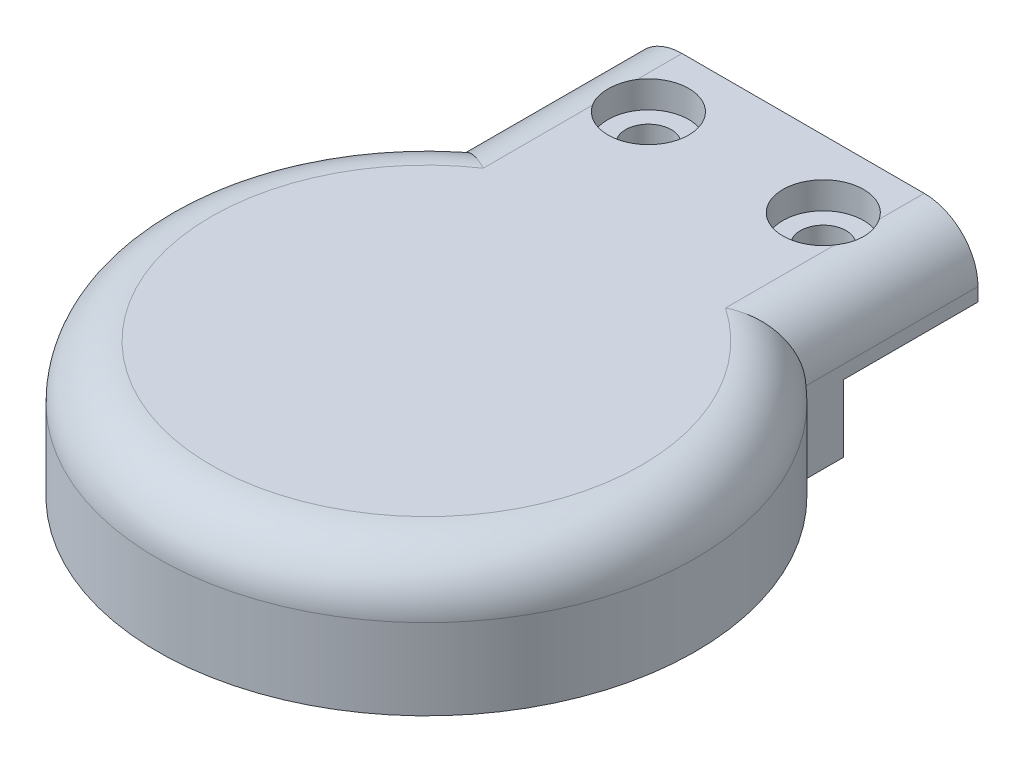
ISO-10303-21;
HEADER;
FILE_DESCRIPTION(('STEP AP214'),'2;1');
FILE_NAME('part.step','',(''),(''),'','','');
FILE_SCHEMA(('AUTOMOTIVE_DESIGN { 1 0 10303 214 1 1 1 1 }'));
ENDSEC;
DATA;
#1=APPLICATION_CONTEXT('core data for automotive mechanical design processes');
#2=APPLICATION_PROTOCOL_DEFINITION('international standard','automotive_design',2000,#1);
#3=PRODUCT_CONTEXT('',#1,'mechanical');
#4=PRODUCT('Part','Part','',(#3));
#5=PRODUCT_RELATED_PRODUCT_CATEGORY('part','',(#4));
#6=PRODUCT_DEFINITION_FORMATION('','',#4);
#7=PRODUCT_DEFINITION_CONTEXT('part definition',#1,'design');
#8=PRODUCT_DEFINITION('design','',#6,#7);
#9=PRODUCT_DEFINITION_SHAPE('','',#8);
#10=(LENGTH_UNIT() NAMED_UNIT(*) SI_UNIT(.MILLI.,.METRE.));
#11=(NAMED_UNIT(*) PLANE_ANGLE_UNIT() SI_UNIT($,.RADIAN.));
#12=(NAMED_UNIT(*) SI_UNIT($,.STERADIAN.) SOLID_ANGLE_UNIT());
#13=UNCERTAINTY_MEASURE_WITH_UNIT(LENGTH_MEASURE(1.E-05),#10,'distance_accuracy_value','');
#14=(GEOMETRIC_REPRESENTATION_CONTEXT(3) GLOBAL_UNCERTAINTY_ASSIGNED_CONTEXT((#13)) GLOBAL_UNIT_ASSIGNED_CONTEXT((#10,
#11,#12)) REPRESENTATION_CONTEXT('',''));
#15=CARTESIAN_POINT('',(0.,0.,0.));
#16=DIRECTION('',(0.,0.,1.));
#17=DIRECTION('',(1.,0.,0.));
#18=AXIS2_PLACEMENT_3D('',#15,#16,#17);
#19=CARTESIAN_POINT('',(-3.25,7.5,5.));
#20=DIRECTION('',(0.,-1.,0.));
#21=DIRECTION('',(0.,0.,-1.));
#22=AXIS2_PLACEMENT_3D('',#19,#20,#21);
#23=CYLINDRICAL_SURFACE('',#22,0.85);
#24=CARTESIAN_POINT('',(-3.25,2.5,5.));
#25=DIRECTION('',(0.,1.,0.));
#26=DIRECTION('',(0.,0.,1.));
#27=AXIS2_PLACEMENT_3D('',#24,#25,#26);
#28=CIRCLE('',#27,0.85);
#29=CARTESIAN_POINT('',(-3.25,2.5,4.15));
#30=VERTEX_POINT('',#29);
#31=EDGE_CURVE('E210',#30,#30,#28,.T.);
#32=CARTESIAN_POINT('',(-3.25,4.,5.));
#33=DIRECTION('',(0.,1.,0.));
#34=DIRECTION('',(0.,0.,1.));
#35=AXIS2_PLACEMENT_3D('',#32,#33,#34);
#36=CIRCLE('',#35,0.85);
#37=CARTESIAN_POINT('',(-3.25,4.,4.15));
#38=VERTEX_POINT('',#37);
#39=EDGE_CURVE('E214',#38,#38,#36,.F.);
#40=CARTESIAN_POINT('',(-3.25,2.5,4.15));
#41=CARTESIAN_POINT('',(-3.25,2.515625,4.15));
#42=CARTESIAN_POINT('',(-3.25,2.53125,4.15));
#43=CARTESIAN_POINT('',(-3.25,2.5625,4.15));
#44=CARTESIAN_POINT('',(-3.25,2.578125,4.15));
#45=CARTESIAN_POINT('',(-3.25,2.609375,4.15));
#46=CARTESIAN_POINT('',(-3.25,2.625,4.15));
#47=CARTESIAN_POINT('',(-3.25,2.65625,4.15));
#48=CARTESIAN_POINT('',(-3.25,2.671875,4.15));
#49=CARTESIAN_POINT('',(-3.25,2.703125,4.15));
#50=CARTESIAN_POINT('',(-3.25,2.71875,4.15));
#51=CARTESIAN_POINT('',(-3.25,2.75,4.15));
#52=CARTESIAN_POINT('',(-3.25,2.765625,4.15));
#53=CARTESIAN_POINT('',(-3.25,2.796875,4.15));
#54=CARTESIAN_POINT('',(-3.25,2.8125,4.15));
#55=CARTESIAN_POINT('',(-3.25,2.84375,4.15));
#56=CARTESIAN_POINT('',(-3.25,2.859375,4.15));
#57=CARTESIAN_POINT('',(-3.25,2.890625,4.15));
#58=CARTESIAN_POINT('',(-3.25,2.90625,4.15));
#59=CARTESIAN_POINT('',(-3.25,2.9375,4.15));
#60=CARTESIAN_POINT('',(-3.25,2.953125,4.15));
#61=CARTESIAN_POINT('',(-3.25,2.984375,4.15));
#62=CARTESIAN_POINT('',(-3.25,3.,4.15));
#63=CARTESIAN_POINT('',(-3.25,3.03125,4.15));
#64=CARTESIAN_POINT('',(-3.25,3.046875,4.15));
#65=CARTESIAN_POINT('',(-3.25,3.078125,4.15));
#66=CARTESIAN_POINT('',(-3.25,3.09375,4.15));
#67=CARTESIAN_POINT('',(-3.25,3.125,4.15));
#68=CARTESIAN_POINT('',(-3.25,3.140625,4.15));
#69=CARTESIAN_POINT('',(-3.25,3.171875,4.15));
#70=CARTESIAN_POINT('',(-3.25,3.1875,4.15));
#71=CARTESIAN_POINT('',(-3.25,3.21875,4.15));
#72=CARTESIAN_POINT('',(-3.25,3.234375,4.15));
#73=CARTESIAN_POINT('',(-3.25,3.265625,4.15));
#74=CARTESIAN_POINT('',(-3.25,3.28125,4.15));
#75=CARTESIAN_POINT('',(-3.25,3.3125,4.15));
#76=CARTESIAN_POINT('',(-3.25,3.328125,4.15));
#77=CARTESIAN_POINT('',(-3.25,3.359375,4.15));
#78=CARTESIAN_POINT('',(-3.25,3.375,4.15));
#79=CARTESIAN_POINT('',(-3.25,3.40625,4.15));
#80=CARTESIAN_POINT('',(-3.25,3.421875,4.15));
#81=CARTESIAN_POINT('',(-3.25,3.453125,4.15));
#82=CARTESIAN_POINT('',(-3.25,3.46875,4.15));
#83=CARTESIAN_POINT('',(-3.25,3.5,4.15));
#84=CARTESIAN_POINT('',(-3.25,3.515625,4.15));
#85=CARTESIAN_POINT('',(-3.25,3.546875,4.15));
#86=CARTESIAN_POINT('',(-3.25,3.5625,4.15));
#87=CARTESIAN_POINT('',(-3.25,3.59375,4.15));
#88=CARTESIAN_POINT('',(-3.25,3.609375,4.15));
#89=CARTESIAN_POINT('',(-3.25,3.640625,4.15));
#90=CARTESIAN_POINT('',(-3.25,3.65625,4.15));
#91=CARTESIAN_POINT('',(-3.25,3.6875,4.15));
#92=CARTESIAN_POINT('',(-3.25,3.703125,4.15));
#93=CARTESIAN_POINT('',(-3.25,3.734375,4.15));
#94=CARTESIAN_POINT('',(-3.25,3.75,4.15));
#95=CARTESIAN_POINT('',(-3.25,3.78125,4.15));
#96=CARTESIAN_POINT('',(-3.25,3.796875,4.15));
#97=CARTESIAN_POINT('',(-3.25,3.828125,4.15));
#98=CARTESIAN_POINT('',(-3.25,3.84375,4.15));
#99=CARTESIAN_POINT('',(-3.25,3.875,4.15));
#100=CARTESIAN_POINT('',(-3.25,3.890625,4.15));
#101=CARTESIAN_POINT('',(-3.25,3.921875,4.15));
#102=CARTESIAN_POINT('',(-3.25,3.9375,4.15));
#103=CARTESIAN_POINT('',(-3.25,3.96875,4.15));
#104=CARTESIAN_POINT('',(-3.25,3.984375,4.15));
#105=CARTESIAN_POINT('',(-3.25,4.,4.15));
#106=B_SPLINE_CURVE_WITH_KNOTS('',3,(#40,#41,#42,#43,#44,#45,#46,#47,#48,#49,#50,#51,#52,#53,
#54,#55,#56,#57,#58,#59,#60,#61,#62,#63,#64,#65,#66,#67,#68,#69,#70,#71,#72,#73,#74,#75,#76,#77,
#78,#79,#80,#81,#82,#83,#84,#85,#86,#87,#88,#89,#90,#91,#92,#93,#94,#95,#96,#97,#98,#99,#100,
#101,#102,#103,#104,#105),.UNSPECIFIED.,.F.,.F.,(4,2,2,2,2,2,2,2,2,2,2,2,2,2,2,2,2,2,2,2,2,2,2,
2,2,2,2,2,2,2,2,2,4),(0.,0.046875,0.0937500000000001,0.140625,0.1875,0.234375,0.28125,0.328125,
0.375,0.421875,0.46875,0.515625,0.5625,0.609375000000001,0.656250000000001,0.703125000000001,
0.750000000000001,0.796875000000001,0.843750000000001,0.890625000000001,0.937500000000001,
0.984375000000001,1.03125,1.078125,1.125,1.171875,1.21875,1.265625,1.3125,1.359375,1.40625,
1.453125,1.5),.UNSPECIFIED.);
#107=EDGE_CURVE('BSEAM53',#30,#38,#106,.T.);
#108=ORIENTED_EDGE('',*,*,#31,.F.);
#109=ORIENTED_EDGE('',*,*,#39,.F.);
#110=ORIENTED_EDGE('',*,*,#107,.T.);
#111=ORIENTED_EDGE('',*,*,#107,.F.);
#112=EDGE_LOOP('',(#108,#110,#109,#111));
#113=FACE_BOUND('',#112,.T.);
#114=ADVANCED_FACE('F53',(#113),#23,.F.);
#115=CARTESIAN_POINT('',(3.25,7.5,5.));
#116=DIRECTION('',(0.,-1.,0.));
#117=DIRECTION('',(0.,0.,-1.));
#118=AXIS2_PLACEMENT_3D('',#115,#116,#117);
#119=CYLINDRICAL_SURFACE('',#118,0.85);
#120=CARTESIAN_POINT('',(3.25,2.5,5.));
#121=DIRECTION('',(0.,1.,0.));
#122=DIRECTION('',(0.,0.,1.));
#123=AXIS2_PLACEMENT_3D('',#120,#121,#122);
#124=CIRCLE('',#123,0.85);
#125=CARTESIAN_POINT('',(3.25,2.5,4.15));
#126=VERTEX_POINT('',#125);
#127=EDGE_CURVE('E171',#126,#126,#124,.F.);
#128=CARTESIAN_POINT('',(3.25,4.,5.));
#129=DIRECTION('',(0.,1.,0.));
#130=DIRECTION('',(0.,0.,1.));
#131=AXIS2_PLACEMENT_3D('',#128,#129,#130);
#132=CIRCLE('',#131,0.85);
#133=CARTESIAN_POINT('',(3.25,4.,4.15));
#134=VERTEX_POINT('',#133);
#135=EDGE_CURVE('E218',#134,#134,#132,.T.);
#136=CARTESIAN_POINT('',(3.25,2.5,4.15));
#137=CARTESIAN_POINT('',(3.25,2.515625,4.15));
#138=CARTESIAN_POINT('',(3.25,2.53125,4.15));
#139=CARTESIAN_POINT('',(3.25,2.5625,4.15));
#140=CARTESIAN_POINT('',(3.25,2.578125,4.15));
#141=CARTESIAN_POINT('',(3.25,2.609375,4.15));
#142=CARTESIAN_POINT('',(3.25,2.625,4.15));
#143=CARTESIAN_POINT('',(3.25,2.65625,4.15));
#144=CARTESIAN_POINT('',(3.25,2.671875,4.15));
#145=CARTESIAN_POINT('',(3.25,2.703125,4.15));
#146=CARTESIAN_POINT('',(3.25,2.71875,4.15));
#147=CARTESIAN_POINT('',(3.25,2.75,4.15));
#148=CARTESIAN_POINT('',(3.25,2.765625,4.15));
#149=CARTESIAN_POINT('',(3.25,2.796875,4.15));
#150=CARTESIAN_POINT('',(3.25,2.8125,4.15));
#151=CARTESIAN_POINT('',(3.25,2.84375,4.15));
#152=CARTESIAN_POINT('',(3.25,2.859375,4.15));
#153=CARTESIAN_POINT('',(3.25,2.890625,4.15));
#154=CARTESIAN_POINT('',(3.25,2.90625,4.15));
#155=CARTESIAN_POINT('',(3.25,2.9375,4.15));
#156=CARTESIAN_POINT('',(3.25,2.953125,4.15));
#157=CARTESIAN_POINT('',(3.25,2.984375,4.15));
#158=CARTESIAN_POINT('',(3.25,3.,4.15));
#159=CARTESIAN_POINT('',(3.25,3.03125,4.15));
#160=CARTESIAN_POINT('',(3.25,3.046875,4.15));
#161=CARTESIAN_POINT('',(3.25,3.078125,4.15));
#162=CARTESIAN_POINT('',(3.25,3.09375,4.15));
#163=CARTESIAN_POINT('',(3.25,3.125,4.15));
#164=CARTESIAN_POINT('',(3.25,3.140625,4.15));
#165=CARTESIAN_POINT('',(3.25,3.171875,4.15));
#166=CARTESIAN_POINT('',(3.25,3.1875,4.15));
#167=CARTESIAN_POINT('',(3.25,3.21875,4.15));
#168=CARTESIAN_POINT('',(3.25,3.234375,4.15));
#169=CARTESIAN_POINT('',(3.25,3.265625,4.15));
#170=CARTESIAN_POINT('',(3.25,3.28125,4.15));
#171=CARTESIAN_POINT('',(3.25,3.3125,4.15));
#172=CARTESIAN_POINT('',(3.25,3.328125,4.15));
#173=CARTESIAN_POINT('',(3.25,3.359375,4.15));
#174=CARTESIAN_POINT('',(3.25,3.375,4.15));
#175=CARTESIAN_POINT('',(3.25,3.40625,4.15));
#176=CARTESIAN_POINT('',(3.25,3.421875,4.15));
#177=CARTESIAN_POINT('',(3.25,3.453125,4.15));
#178=CARTESIAN_POINT('',(3.25,3.46875,4.15));
#179=CARTESIAN_POINT('',(3.25,3.5,4.15));
#180=CARTESIAN_POINT('',(3.25,3.515625,4.15));
#181=CARTESIAN_POINT('',(3.25,3.546875,4.15));
#182=CARTESIAN_POINT('',(3.25,3.5625,4.15));
#183=CARTESIAN_POINT('',(3.25,3.59375,4.15));
#184=CARTESIAN_POINT('',(3.25,3.609375,4.15));
#185=CARTESIAN_POINT('',(3.25,3.640625,4.15));
#186=CARTESIAN_POINT('',(3.25,3.65625,4.15));
#187=CARTESIAN_POINT('',(3.25,3.6875,4.15));
#188=CARTESIAN_POINT('',(3.25,3.703125,4.15));
#189=CARTESIAN_POINT('',(3.25,3.734375,4.15));
#190=CARTESIAN_POINT('',(3.25,3.75,4.15));
#191=CARTESIAN_POINT('',(3.25,3.78125,4.15));
#192=CARTESIAN_POINT('',(3.25,3.796875,4.15));
#193=CARTESIAN_POINT('',(3.25,3.828125,4.15));
#194=CARTESIAN_POINT('',(3.25,3.84375,4.15));
#195=CARTESIAN_POINT('',(3.25,3.875,4.15));
#196=CARTESIAN_POINT('',(3.25,3.890625,4.15));
#197=CARTESIAN_POINT('',(3.25,3.921875,4.15));
#198=CARTESIAN_POINT('',(3.25,3.9375,4.15));
#199=CARTESIAN_POINT('',(3.25,3.96875,4.15));
#200=CARTESIAN_POINT('',(3.25,3.984375,4.15));
#201=CARTESIAN_POINT('',(3.25,4.,4.15));
#202=B_SPLINE_CURVE_WITH_KNOTS('',3,(#136,#137,#138,#139,#140,#141,#142,#143,#144,#145,#146,
#147,#148,#149,#150,#151,#152,#153,#154,#155,#156,#157,#158,#159,#160,#161,#162,#163,#164,#165,
#166,#167,#168,#169,#170,#171,#172,#173,#174,#175,#176,#177,#178,#179,#180,#181,#182,#183,#184,
#185,#186,#187,#188,#189,#190,#191,#192,#193,#194,#195,#196,#197,#198,#199,#200,#201),
.UNSPECIFIED.,.F.,.F.,(4,2,2,2,2,2,2,2,2,2,2,2,2,2,2,2,2,2,2,2,2,2,2,2,2,2,2,2,2,2,2,2,4),(0.,
0.046875,0.0937500000000001,0.140625,0.1875,0.234375,0.28125,0.328125,0.375,0.421875,0.46875,
0.515625,0.5625,0.609375000000001,0.656250000000001,0.703125000000001,0.750000000000001,
0.796875000000001,0.843750000000001,0.890625000000001,0.937500000000001,0.984375000000001,
1.03125,1.078125,1.125,1.171875,1.21875,1.265625,1.3125,1.359375,1.40625,1.453125,1.5),.UNSPECIFIED.);
#203=EDGE_CURVE('BSEAM271',#126,#134,#202,.T.);
#204=ORIENTED_EDGE('',*,*,#127,.T.);
#205=ORIENTED_EDGE('',*,*,#135,.T.);
#206=ORIENTED_EDGE('',*,*,#203,.T.);
#207=ORIENTED_EDGE('',*,*,#203,.F.);
#208=EDGE_LOOP('',(#204,#206,#205,#207));
#209=FACE_BOUND('',#208,.T.);
#210=ADVANCED_FACE('F271',(#209),#119,.F.);
#211=CARTESIAN_POINT('',(0.,5.,16.5));
#212=DIRECTION('',(0.,1.,0.));
#213=DIRECTION('',(0.,0.,1.));
#214=AXIS2_PLACEMENT_3D('',#211,#212,#213);
#215=PLANE('',#214);
#216=CARTESIAN_POINT('',(3.25,5.,5.));
#217=DIRECTION('',(0.,1.,0.));
#218=DIRECTION('',(0.,0.,1.));
#219=AXIS2_PLACEMENT_3D('',#216,#217,#218);
#220=CIRCLE('',#219,1.5);
#221=CARTESIAN_POINT('',(4.5,5.,4.17084380241115));
#222=VERTEX_POINT('',#221);
#223=CARTESIAN_POINT('',(4.5,5.,5.82915619758885));
#224=VERTEX_POINT('',#223);
#225=EDGE_CURVE('E340',#222,#224,#220,.T.);
#226=ORIENTED_EDGE('',*,*,#225,.F.);
#227=DIRECTION('',(0.,0.,-1.));
#228=VECTOR('',#227,1.);
#229=CARTESIAN_POINT('',(4.5,5.,2.5));
#230=LINE('',#229,#228);
#231=CARTESIAN_POINT('',(4.5,5.,2.5));
#232=VERTEX_POINT('',#231);
#233=EDGE_CURVE('E243',#222,#232,#230,.T.);
#234=ORIENTED_EDGE('',*,*,#233,.T.);
#235=DIRECTION('',(-1.,0.,0.));
#236=VECTOR('',#235,1.);
#237=CARTESIAN_POINT('',(6.49999999999998,5.,2.5));
#238=LINE('',#237,#236);
#239=CARTESIAN_POINT('',(-4.5,5.,2.5));
#240=VERTEX_POINT('',#239);
#241=EDGE_CURVE('E161',#232,#240,#238,.T.);
#242=ORIENTED_EDGE('',*,*,#241,.T.);
#243=DIRECTION('',(0.,0.,-1.));
#244=VECTOR('',#243,1.);
#245=CARTESIAN_POINT('',(-4.5,5.,16.5));
#246=LINE('',#245,#244);
#247=CARTESIAN_POINT('',(-4.5,5.,4.17084380241115));
#248=VERTEX_POINT('',#247);
#249=EDGE_CURVE('E236',#240,#248,#246,.F.);
#250=ORIENTED_EDGE('',*,*,#249,.T.);
#251=CARTESIAN_POINT('',(-3.25,5.,5.));
#252=DIRECTION('',(0.,1.,0.));
#253=DIRECTION('',(0.,0.,1.));
#254=AXIS2_PLACEMENT_3D('',#251,#252,#253);
#255=CIRCLE('',#254,1.5);
#256=CARTESIAN_POINT('',(-4.5,5.,5.82915619758885));
#257=VERTEX_POINT('',#256);
#258=EDGE_CURVE('E338',#257,#248,#255,.T.);
#259=ORIENTED_EDGE('',*,*,#258,.F.);
#260=DIRECTION('',(0.,0.,-1.));
#261=VECTOR('',#260,1.);
#262=CARTESIAN_POINT('',(-4.5,5.,16.5));
#263=LINE('',#262,#261);
#264=CARTESIAN_POINT('',(-4.5,5.,9.88562172233852));
#265=VERTEX_POINT('',#264);
#266=EDGE_CURVE('E232',#257,#265,#263,.F.);
#267=ORIENTED_EDGE('',*,*,#266,.T.);
#268=CARTESIAN_POINT('',(0.,5.,16.5));
#269=DIRECTION('',(0.,1.,0.));
#270=DIRECTION('',(0.,0.,1.));
#271=AXIS2_PLACEMENT_3D('',#268,#269,#270);
#272=CIRCLE('',#271,8.);
#273=CARTESIAN_POINT('',(4.5,5.,9.88562172233852));
#274=VERTEX_POINT('',#273);
#275=EDGE_CURVE('E209',#265,#274,#272,.T.);
#276=ORIENTED_EDGE('',*,*,#275,.T.);
#277=DIRECTION('',(0.,0.,-1.));
#278=VECTOR('',#277,1.);
#279=CARTESIAN_POINT('',(4.5,5.,2.5));
#280=LINE('',#279,#278);
#281=EDGE_CURVE('E239',#274,#224,#280,.T.);
#282=ORIENTED_EDGE('',*,*,#281,.T.);
#283=EDGE_LOOP('',(#226,#234,#242,#250,#259,#267,#276,#282));
#284=FACE_BOUND('',#283,.T.);
#285=ADVANCED_FACE('F274',(#284),#215,.T.);
#286=CARTESIAN_POINT('',(0.,2.5,0.));
#287=DIRECTION('',(0.,1.,0.));
#288=DIRECTION('',(0.,0.,1.));
#289=AXIS2_PLACEMENT_3D('',#286,#287,#288);
#290=PLANE('',#289);
#291=ORIENTED_EDGE('',*,*,#31,.T.);
#292=EDGE_LOOP('',(#291));
#293=FACE_BOUND('',#292,.T.);
#294=DIRECTION('',(0.,0.,1.));
#295=VECTOR('',#294,1.);
#296=CARTESIAN_POINT('',(-6.5,2.5,2.5));
#297=LINE('',#296,#295);
#298=CARTESIAN_POINT('',(-6.5,2.5,2.5));
#299=VERTEX_POINT('',#298);
#300=CARTESIAN_POINT('',(-6.5,2.5,7.5));
#301=VERTEX_POINT('',#300);
#302=EDGE_CURVE('E144',#299,#301,#297,.T.);
#303=ORIENTED_EDGE('',*,*,#302,.F.);
#304=DIRECTION('',(-1.,0.,0.));
#305=VECTOR('',#304,1.);
#306=CARTESIAN_POINT('',(6.49999999999998,2.5,2.5));
#307=LINE('',#306,#305);
#308=CARTESIAN_POINT('',(6.49999999999998,2.5,2.5));
#309=VERTEX_POINT('',#308);
#310=EDGE_CURVE('E179',#309,#299,#307,.T.);
#311=ORIENTED_EDGE('',*,*,#310,.F.);
#312=DIRECTION('',(0.,0.,-1.));
#313=VECTOR('',#312,1.);
#314=CARTESIAN_POINT('',(6.5,2.5,7.5));
#315=LINE('',#314,#313);
#316=CARTESIAN_POINT('',(6.5,2.5,7.5));
#317=VERTEX_POINT('',#316);
#318=EDGE_CURVE('E147',#317,#309,#315,.T.);
#319=ORIENTED_EDGE('',*,*,#318,.F.);
#320=DIRECTION('',(1.,0.,0.));
#321=VECTOR('',#320,1.);
#322=CARTESIAN_POINT('',(-6.5,2.5,7.5));
#323=LINE('',#322,#321);
#324=EDGE_CURVE('E138',#301,#317,#323,.T.);
#325=ORIENTED_EDGE('',*,*,#324,.F.);
#326=EDGE_LOOP('',(#303,#311,#319,#325));
#327=FACE_BOUND('',#326,.T.);
#328=ORIENTED_EDGE('',*,*,#127,.F.);
#329=EDGE_LOOP('',(#328));
#330=FACE_BOUND('',#329,.T.);
#331=ADVANCED_FACE('F140',(#293,#327,#330),#290,.F.);
#332=CARTESIAN_POINT('',(0.,0.,16.5));
#333=DIRECTION('',(0.,1.,0.));
#334=DIRECTION('',(0.,0.,1.));
#335=AXIS2_PLACEMENT_3D('',#332,#333,#334);
#336=PLANE('',#335);
#337=CARTESIAN_POINT('',(0.,0.,16.5));
#338=DIRECTION('',(0.,1.,0.));
#339=DIRECTION('',(0.,0.,1.));
#340=AXIS2_PLACEMENT_3D('',#337,#338,#339);
#341=CIRCLE('',#340,6.1);
#342=CARTESIAN_POINT('',(0.,0.,22.6));
#343=VERTEX_POINT('',#342);
#344=EDGE_CURVE('E348',#343,#343,#341,.T.);
#345=ORIENTED_EDGE('',*,*,#344,.T.);
#346=EDGE_LOOP('',(#345));
#347=FACE_BOUND('',#346,.T.);
#348=DIRECTION('',(1.,0.,0.));
#349=VECTOR('',#348,1.);
#350=CARTESIAN_POINT('',(-6.5,0.,7.5));
#351=LINE('',#350,#349);
#352=CARTESIAN_POINT('',(-6.5,0.,7.5));
#353=VERTEX_POINT('',#352);
#354=CARTESIAN_POINT('',(6.5,0.,7.5));
#355=VERTEX_POINT('',#354);
#356=EDGE_CURVE('E156',#353,#355,#351,.T.);
#357=ORIENTED_EDGE('',*,*,#356,.T.);
#358=DIRECTION('',(0.,0.,-1.));
#359=VECTOR('',#358,1.);
#360=CARTESIAN_POINT('',(6.5,0.,8.90065792321467));
#361=LINE('',#360,#359);
#362=CARTESIAN_POINT('',(6.5,0.,8.90065792321467));
#363=VERTEX_POINT('',#362);
#364=EDGE_CURVE('E196',#363,#355,#361,.T.);
#365=ORIENTED_EDGE('',*,*,#364,.F.);
#366=CARTESIAN_POINT('',(0.,0.,16.5));
#367=DIRECTION('',(0.,1.,0.));
#368=DIRECTION('',(0.,0.,1.));
#369=AXIS2_PLACEMENT_3D('',#366,#367,#368);
#370=CIRCLE('',#369,10.);
#371=CARTESIAN_POINT('',(-6.5,0.,8.90065792321466));
#372=VERTEX_POINT('',#371);
#373=EDGE_CURVE('E192',#372,#363,#370,.T.);
#374=ORIENTED_EDGE('',*,*,#373,.F.);
#375=DIRECTION('',(0.,0.,-1.));
#376=VECTOR('',#375,1.);
#377=CARTESIAN_POINT('',(-6.5,0.,8.90065792321466));
#378=LINE('',#377,#376);
#379=EDGE_CURVE('E200',#372,#353,#378,.T.);
#380=ORIENTED_EDGE('',*,*,#379,.T.);
#381=EDGE_LOOP('',(#357,#365,#374,#380));
#382=FACE_BOUND('',#381,.T.);
#383=ADVANCED_FACE('F281',(#347,#382),#336,.F.);
#384=CARTESIAN_POINT('',(6.5,5.,8.90065792321467));
#385=DIRECTION('',(-1.,0.,0.));
#386=DIRECTION('',(0.,0.,1.));
#387=AXIS2_PLACEMENT_3D('',#384,#385,#386);
#388=PLANE('',#387);
#389=DIRECTION('',(0.,-1.,0.));
#390=VECTOR('',#389,1.);
#391=CARTESIAN_POINT('',(6.49999999999998,5.,2.5));
#392=LINE('',#391,#390);
#393=CARTESIAN_POINT('',(6.49999999999998,3.,2.5));
#394=VERTEX_POINT('',#393);
#395=EDGE_CURVE('E189',#394,#309,#392,.T.);
#396=ORIENTED_EDGE('',*,*,#395,.F.);
#397=DIRECTION('',(0.,0.,-1.));
#398=VECTOR('',#397,1.);
#399=CARTESIAN_POINT('',(6.5,3.,11.8363104734556));
#400=LINE('',#399,#398);
#401=CARTESIAN_POINT('',(6.5,3.,8.90065792321467));
#402=VERTEX_POINT('',#401);
#403=EDGE_CURVE('E326',#394,#402,#400,.F.);
#404=ORIENTED_EDGE('',*,*,#403,.T.);
#405=DIRECTION('',(0.,-1.,0.));
#406=VECTOR('',#405,1.);
#407=CARTESIAN_POINT('',(6.5,5.,8.90065792321467));
#408=LINE('',#407,#406);
#409=EDGE_CURVE('E206',#402,#363,#408,.T.);
#410=ORIENTED_EDGE('',*,*,#409,.T.);
#411=ORIENTED_EDGE('',*,*,#364,.T.);
#412=DIRECTION('',(0.,-1.,0.));
#413=VECTOR('',#412,1.);
#414=CARTESIAN_POINT('',(6.5,2.5,7.5));
#415=LINE('',#414,#413);
#416=EDGE_CURVE('E162',#317,#355,#415,.T.);
#417=ORIENTED_EDGE('',*,*,#416,.F.);
#418=ORIENTED_EDGE('',*,*,#318,.T.);
#419=EDGE_LOOP('',(#396,#404,#410,#411,#417,#418));
#420=FACE_BOUND('',#419,.T.);
#421=ADVANCED_FACE('F294',(#420),#388,.F.);
#422=CARTESIAN_POINT('',(-6.5,5.,8.90065792321466));
#423=DIRECTION('',(-1.,0.,0.));
#424=DIRECTION('',(0.,0.,1.));
#425=AXIS2_PLACEMENT_3D('',#422,#423,#424);
#426=PLANE('',#425);
#427=DIRECTION('',(0.,-1.,0.));
#428=VECTOR('',#427,1.);
#429=CARTESIAN_POINT('',(-6.5,5.,8.90065792321466));
#430=LINE('',#429,#428);
#431=CARTESIAN_POINT('',(-6.5,3.,8.90065792321466));
#432=VERTEX_POINT('',#431);
#433=EDGE_CURVE('E203',#432,#372,#430,.T.);
#434=ORIENTED_EDGE('',*,*,#433,.F.);
#435=DIRECTION('',(0.,0.,-1.));
#436=VECTOR('',#435,1.);
#437=CARTESIAN_POINT('',(-6.5,3.,8.90065792321466));
#438=LINE('',#437,#436);
#439=CARTESIAN_POINT('',(-6.5,3.,2.5));
#440=VERTEX_POINT('',#439);
#441=EDGE_CURVE('E323',#432,#440,#438,.T.);
#442=ORIENTED_EDGE('',*,*,#441,.T.);
#443=DIRECTION('',(0.,-1.,0.));
#444=VECTOR('',#443,1.);
#445=CARTESIAN_POINT('',(-6.5,5.,2.5));
#446=LINE('',#445,#444);
#447=EDGE_CURVE('E167',#440,#299,#446,.T.);
#448=ORIENTED_EDGE('',*,*,#447,.T.);
#449=ORIENTED_EDGE('',*,*,#302,.T.);
#450=DIRECTION('',(0.,-1.,0.));
#451=VECTOR('',#450,1.);
#452=CARTESIAN_POINT('',(-6.5,2.5,7.5));
#453=LINE('',#452,#451);
#454=EDGE_CURVE('E153',#301,#353,#453,.T.);
#455=ORIENTED_EDGE('',*,*,#454,.T.);
#456=ORIENTED_EDGE('',*,*,#379,.F.);
#457=EDGE_LOOP('',(#434,#442,#448,#449,#455,#456));
#458=FACE_BOUND('',#457,.T.);
#459=ADVANCED_FACE('F165',(#458),#426,.T.);
#460=CARTESIAN_POINT('',(0.,5.,16.5));
#461=DIRECTION('',(0.,-1.,0.));
#462=DIRECTION('',(0.,0.,-1.));
#463=AXIS2_PLACEMENT_3D('',#460,#461,#462);
#464=CYLINDRICAL_SURFACE('',#463,10.);
#465=ORIENTED_EDGE('',*,*,#409,.F.);
#466=CARTESIAN_POINT('',(0.,3.,16.5));
#467=DIRECTION('',(0.,1.,0.));
#468=DIRECTION('',(0.,0.,1.));
#469=AXIS2_PLACEMENT_3D('',#466,#467,#468);
#470=CIRCLE('',#469,10.);
#471=EDGE_CURVE('E228',#402,#432,#470,.F.);
#472=ORIENTED_EDGE('',*,*,#471,.T.);
#473=ORIENTED_EDGE('',*,*,#433,.T.);
#474=ORIENTED_EDGE('',*,*,#373,.T.);
#475=EDGE_LOOP('',(#465,#472,#473,#474));
#476=FACE_BOUND('',#475,.T.);
#477=ADVANCED_FACE('F288',(#476),#464,.T.);
#478=CARTESIAN_POINT('',(6.49999999999998,5.,2.5));
#479=DIRECTION('',(0.,0.,1.));
#480=DIRECTION('',(1.,0.,0.));
#481=AXIS2_PLACEMENT_3D('',#478,#479,#480);
#482=PLANE('',#481);
#483=ORIENTED_EDGE('',*,*,#241,.F.);
#484=CARTESIAN_POINT('',(4.5,3.,2.5));
#485=DIRECTION('',(0.,0.,1.));
#486=DIRECTION('',(1.,0.,0.));
#487=AXIS2_PLACEMENT_3D('',#484,#485,#486);
#488=CIRCLE('',#487,2.);
#489=EDGE_CURVE('E83',#232,#394,#488,.F.);
#490=ORIENTED_EDGE('',*,*,#489,.T.);
#491=ORIENTED_EDGE('',*,*,#395,.T.);
#492=ORIENTED_EDGE('',*,*,#310,.T.);
#493=ORIENTED_EDGE('',*,*,#447,.F.);
#494=CARTESIAN_POINT('',(-4.5,3.,2.5));
#495=DIRECTION('',(0.,0.,1.));
#496=DIRECTION('',(1.,0.,0.));
#497=AXIS2_PLACEMENT_3D('',#494,#495,#496);
#498=CIRCLE('',#497,2.);
#499=EDGE_CURVE('E75',#440,#240,#498,.F.);
#500=ORIENTED_EDGE('',*,*,#499,.T.);
#501=EDGE_LOOP('',(#483,#490,#491,#492,#493,#500));
#502=FACE_BOUND('',#501,.T.);
#503=ADVANCED_FACE('F285',(#502),#482,.F.);
#504=CARTESIAN_POINT('',(-6.5,2.5,7.5));
#505=DIRECTION('',(0.,0.,-1.));
#506=DIRECTION('',(-1.,0.,0.));
#507=AXIS2_PLACEMENT_3D('',#504,#505,#506);
#508=PLANE('',#507);
#509=ORIENTED_EDGE('',*,*,#356,.F.);
#510=ORIENTED_EDGE('',*,*,#454,.F.);
#511=ORIENTED_EDGE('',*,*,#324,.T.);
#512=ORIENTED_EDGE('',*,*,#416,.T.);
#513=EDGE_LOOP('',(#509,#510,#511,#512));
#514=FACE_BOUND('',#513,.T.);
#515=ADVANCED_FACE('F154',(#514),#508,.T.);
#516=CARTESIAN_POINT('',(3.25,4.,5.));
#517=DIRECTION('',(0.,1.,0.));
#518=DIRECTION('',(0.,0.,1.));
#519=AXIS2_PLACEMENT_3D('',#516,#517,#518);
#520=CYLINDRICAL_SURFACE('',#519,1.5);
#521=CARTESIAN_POINT('',(3.25,4.,5.));
#522=DIRECTION('',(0.,1.,0.));
#523=DIRECTION('',(0.,0.,1.));
#524=AXIS2_PLACEMENT_3D('',#521,#522,#523);
#525=CIRCLE('',#524,1.5);
#526=CARTESIAN_POINT('',(3.25,4.,6.5));
#527=VERTEX_POINT('',#526);
#528=EDGE_CURVE('E174',#527,#527,#525,.T.);
#529=ORIENTED_EDGE('',*,*,#528,.F.);
#530=EDGE_LOOP('',(#529));
#531=FACE_BOUND('',#530,.T.);
#532=ORIENTED_EDGE('',*,*,#225,.T.);
#533=CARTESIAN_POINT('',(4.5,5.,5.82915619758885));
#534=CARTESIAN_POINT('',(4.52329215279486,4.99999671529159,5.79404163937458));
#535=CARTESIAN_POINT('',(4.54509059125683,4.99959373160754,5.75796561515367));
#536=CARTESIAN_POINT('',(4.58557220475522,4.99827160329191,5.68412080849229));
#537=CARTESIAN_POINT('',(4.60425579507885,4.99735252753981,5.64635225256194));
#538=CARTESIAN_POINT('',(4.65540530006613,4.99424848050229,5.53094235849137));
#539=CARTESIAN_POINT('',(4.68303344561551,4.99171515215676,5.45110084523293));
#540=CARTESIAN_POINT('',(4.72451932305099,4.98746827454253,5.28790991491069));
#541=CARTESIAN_POINT('',(4.73837286863107,4.98575497457465,5.20455943943827));
#542=CARTESIAN_POINT('',(4.75191055973572,4.98408408501026,5.03669772857449));
#543=CARTESIAN_POINT('',(4.75159764878376,4.98412613068576,4.9521867379646));
#544=CARTESIAN_POINT('',(4.73684674699269,4.98593962327848,4.78475407374269));
#545=CARTESIAN_POINT('',(4.722459986559,4.98770479776247,4.70182774780242));
#546=CARTESIAN_POINT('',(4.68004562381327,4.99199233138383,4.53958066342131));
#547=CARTESIAN_POINT('',(4.65202771444501,4.99451415199171,4.46025738665362));
#548=CARTESIAN_POINT('',(4.60093183605841,4.9975201668107,4.34682194928338));
#549=CARTESIAN_POINT('',(4.58273367831708,4.99838505638959,4.31045364496937));
#550=CARTESIAN_POINT('',(4.5434816867513,4.99962315876661,4.23937640991274));
#551=CARTESIAN_POINT('',(4.52243347774708,4.99999732488552,4.20466438839616));
#552=CARTESIAN_POINT('',(4.5,5.,4.17084380241115));
#553=B_SPLINE_CURVE_WITH_KNOTS('',3,(#533,#534,#535,#536,#537,#538,#539,#540,#541,#542,#543,
#544,#545,#546,#547,#548,#549,#550,#551,#552),.UNSPECIFIED.,.F.,.F.,(4,2,2,2,2,2,2,2,2,4),(0.,
0.126326789248021,0.252636722481453,0.504915799753385,0.757271524979291,1.00957481566803,
1.26096309832736,1.51217288254111,1.63408495324326,1.75575983472531),.UNSPECIFIED.);
#554=EDGE_CURVE('E246',#224,#222,#553,.T.);
#555=ORIENTED_EDGE('',*,*,#554,.T.);
#556=EDGE_LOOP('',(#532,#555));
#557=FACE_BOUND('',#556,.T.);
#558=ADVANCED_FACE('F257',(#531,#557),#520,.F.);
#559=CARTESIAN_POINT('',(3.25,4.,5.));
#560=DIRECTION('',(0.,1.,0.));
#561=DIRECTION('',(0.,0.,1.));
#562=AXIS2_PLACEMENT_3D('',#559,#560,#561);
#563=PLANE('',#562);
#564=ORIENTED_EDGE('',*,*,#135,.F.);
#565=EDGE_LOOP('',(#564));
#566=FACE_BOUND('',#565,.T.);
#567=ORIENTED_EDGE('',*,*,#528,.T.);
#568=EDGE_LOOP('',(#567));
#569=FACE_BOUND('',#568,.T.);
#570=ADVANCED_FACE('F262',(#566,#569),#563,.T.);
#571=CARTESIAN_POINT('',(-3.25,4.,5.));
#572=DIRECTION('',(0.,1.,0.));
#573=DIRECTION('',(0.,0.,1.));
#574=AXIS2_PLACEMENT_3D('',#571,#572,#573);
#575=PLANE('',#574);
#576=CARTESIAN_POINT('',(-3.25,4.,5.));
#577=DIRECTION('',(0.,1.,0.));
#578=DIRECTION('',(0.,0.,1.));
#579=AXIS2_PLACEMENT_3D('',#576,#577,#578);
#580=CIRCLE('',#579,1.5);
#581=CARTESIAN_POINT('',(-3.25,4.,6.5));
#582=VERTEX_POINT('',#581);
#583=EDGE_CURVE('E222',#582,#582,#580,.T.);
#584=ORIENTED_EDGE('',*,*,#583,.T.);
#585=EDGE_LOOP('',(#584));
#586=FACE_BOUND('',#585,.T.);
#587=ORIENTED_EDGE('',*,*,#39,.T.);
#588=EDGE_LOOP('',(#587));
#589=FACE_BOUND('',#588,.T.);
#590=ADVANCED_FACE('F269',(#586,#589),#575,.T.);
#591=CARTESIAN_POINT('',(-3.25,4.,5.));
#592=DIRECTION('',(0.,1.,0.));
#593=DIRECTION('',(0.,0.,1.));
#594=AXIS2_PLACEMENT_3D('',#591,#592,#593);
#595=CYLINDRICAL_SURFACE('',#594,1.5);
#596=ORIENTED_EDGE('',*,*,#583,.F.);
#597=EDGE_LOOP('',(#596));
#598=FACE_BOUND('',#597,.T.);
#599=ORIENTED_EDGE('',*,*,#258,.T.);
#600=CARTESIAN_POINT('',(-4.5,5.,4.17084380241115));
#601=CARTESIAN_POINT('',(-4.52329215279486,4.99999671529159,4.20595836062542));
#602=CARTESIAN_POINT('',(-4.54509059125682,4.99959373160754,4.24203438484632));
#603=CARTESIAN_POINT('',(-4.58557220475522,4.99827160329191,4.3158791915077));
#604=CARTESIAN_POINT('',(-4.60425579507885,4.99735252753981,4.35364774743806));
#605=CARTESIAN_POINT('',(-4.65540530006613,4.99424848050229,4.46905764150863));
#606=CARTESIAN_POINT('',(-4.68303344561551,4.99171515215676,4.54889915476707));
#607=CARTESIAN_POINT('',(-4.72451932305099,4.98746827454253,4.7120900850893));
#608=CARTESIAN_POINT('',(-4.73837286863107,4.98575497457465,4.79544056056173));
#609=CARTESIAN_POINT('',(-4.75191055973572,4.98408408501026,4.9633022714255));
#610=CARTESIAN_POINT('',(-4.75159764878376,4.98412613068576,5.0478132620354));
#611=CARTESIAN_POINT('',(-4.73684674699269,4.98593962327849,5.2152459262573));
#612=CARTESIAN_POINT('',(-4.722459986559,4.98770479776247,5.29817225219758));
#613=CARTESIAN_POINT('',(-4.68004562381327,4.99199233138383,5.46041933657868));
#614=CARTESIAN_POINT('',(-4.65202771444501,4.99451415199171,5.53974261334638));
#615=CARTESIAN_POINT('',(-4.60093183605841,4.9975201668107,5.65317805071662));
#616=CARTESIAN_POINT('',(-4.58273367831708,4.99838505638959,5.68954635503063));
#617=CARTESIAN_POINT('',(-4.5434816867513,4.99962315876661,5.76062359008726));
#618=CARTESIAN_POINT('',(-4.52243347774708,4.99999732488552,5.79533561160384));
#619=CARTESIAN_POINT('',(-4.5,5.,5.82915619758885));
#620=B_SPLINE_CURVE_WITH_KNOTS('',3,(#600,#601,#602,#603,#604,#605,#606,#607,#608,#609,#610,
#611,#612,#613,#614,#615,#616,#617,#618,#619),.UNSPECIFIED.,.F.,.F.,(4,2,2,2,2,2,2,2,2,4),(0.,
0.126326789248021,0.252636722481453,0.504915799753385,0.75727152497929,1.00957481566803,
1.26096309832736,1.51217288254111,1.63408495324326,1.75575983472531),.UNSPECIFIED.);
#621=EDGE_CURVE('E316',#248,#257,#620,.T.);
#622=ORIENTED_EDGE('',*,*,#621,.T.);
#623=EDGE_LOOP('',(#599,#622));
#624=FACE_BOUND('',#623,.T.);
#625=ADVANCED_FACE('F264',(#598,#624),#595,.F.);
#626=CARTESIAN_POINT('',(0.,3.5,16.5));
#627=DIRECTION('',(0.,-1.,0.));
#628=DIRECTION('',(0.,0.,-1.));
#629=AXIS2_PLACEMENT_3D('',#626,#627,#628);
#630=CYLINDRICAL_SURFACE('',#629,6.1);
#631=CARTESIAN_POINT('',(0.,3.5,16.5));
#632=DIRECTION('',(0.,1.,0.));
#633=DIRECTION('',(0.,0.,1.));
#634=AXIS2_PLACEMENT_3D('',#631,#632,#633);
#635=CIRCLE('',#634,6.1);
#636=CARTESIAN_POINT('',(0.,3.5,22.6));
#637=VERTEX_POINT('',#636);
#638=EDGE_CURVE('E352',#637,#637,#635,.T.);
#639=ORIENTED_EDGE('',*,*,#638,.T.);
#640=EDGE_LOOP('',(#639));
#641=FACE_BOUND('',#640,.T.);
#642=ORIENTED_EDGE('',*,*,#344,.F.);
#643=EDGE_LOOP('',(#642));
#644=FACE_BOUND('',#643,.T.);
#645=ADVANCED_FACE('F398',(#641,#644),#630,.F.);
#646=CARTESIAN_POINT('',(0.,3.5,16.5));
#647=DIRECTION('',(0.,1.,0.));
#648=DIRECTION('',(0.,0.,1.));
#649=AXIS2_PLACEMENT_3D('',#646,#647,#648);
#650=PLANE('',#649);
#651=ORIENTED_EDGE('',*,*,#638,.F.);
#652=EDGE_LOOP('',(#651));
#653=FACE_BOUND('',#652,.T.);
#654=ADVANCED_FACE('F306',(#653),#650,.F.);
#655=CARTESIAN_POINT('',(0.,3.,16.5));
#656=DIRECTION('',(0.,1.,0.));
#657=DIRECTION('',(0.,0.,1.));
#658=AXIS2_PLACEMENT_3D('',#655,#656,#657);
#659=TOROIDAL_SURFACE('',#658,8.,2.);
#660=ORIENTED_EDGE('',*,*,#275,.F.);
#661=CARTESIAN_POINT('',(-6.5,3.,8.90065792321466));
#662=CARTESIAN_POINT('',(-6.50000773421938,3.05242719451266,8.90065510290393));
#663=CARTESIAN_POINT('',(-6.49793870348665,3.10485040512613,8.90160730554759));
#664=CARTESIAN_POINT('',(-6.48970634301709,3.20929444477885,8.90539988023349));
#665=CARTESIAN_POINT('',(-6.48354390889175,3.26131535931984,8.90823983924634));
#666=CARTESIAN_POINT('',(-6.46720838443451,3.36442926604754,8.91577478546026));
#667=CARTESIAN_POINT('',(-6.45704734182829,3.41552456776739,8.920464200381));
#668=CARTESIAN_POINT('',(-6.43283703842842,3.51656958434587,8.93165207534621));
#669=CARTESIAN_POINT('',(-6.41878769827696,3.56651927580076,8.93815057231297));
#670=CARTESIAN_POINT('',(-6.37102368032271,3.71409346610911,8.96027941781893));
#671=CARTESIAN_POINT('',(-6.33167194230046,3.80957374761717,8.97855277398749));
#672=CARTESIAN_POINT('',(-6.23955076185052,3.99219438936846,9.02154329779954));
#673=CARTESIAN_POINT('',(-6.18677541842469,4.07933105852318,9.04626329950058));
#674=CARTESIAN_POINT('',(-6.06770484380131,4.24625911485326,9.10238240403307));
#675=CARTESIAN_POINT('',(-6.00100862237272,4.3256969205638,9.13398118886747));
#676=CARTESIAN_POINT('',(-5.85757757089289,4.47224607063099,9.20245148574329));
#677=CARTESIAN_POINT('',(-5.78084002951207,4.53935407391997,9.23932442214785));
#678=CARTESIAN_POINT('',(-5.61262731714174,4.66554674252368,9.32085030988754));
#679=CARTESIAN_POINT('',(-5.52045186737121,4.72343999664791,9.36590000029499));
#680=CARTESIAN_POINT('',(-5.32963274112005,4.82299299361824,9.46013850272028));
#681=CARTESIAN_POINT('',(-5.23098451912104,4.86464118266374,9.5093302305111));
#682=CARTESIAN_POINT('',(-5.02908367104322,4.93170296304272,9.6111541146006));
#683=CARTESIAN_POINT('',(-4.92580261741323,4.95699543688568,9.66380882687737));
#684=CARTESIAN_POINT('',(-4.71777612876569,4.99089089445975,9.77115882990557));
#685=CARTESIAN_POINT('',(-4.61303402179223,4.99952703364404,9.82584984548321));
#686=CARTESIAN_POINT('',(-4.50579639901566,4.99999371336865,9.88255508565299));
#687=CARTESIAN_POINT('',(-4.50289803067751,5.00000001295941,9.88408822450502));
#688=CARTESIAN_POINT('',(-4.5,5.,9.88562172233852));
#689=B_SPLINE_CURVE_WITH_KNOTS('',3,(#661,#662,#663,#664,#665,#666,#667,#668,#669,#670,#671,
#672,#673,#674,#675,#676,#677,#678,#679,#680,#681,#682,#683,#684,#685,#686,#687,#688),
.UNSPECIFIED.,.F.,.F.,(4,2,2,2,2,2,2,2,2,2,2,2,2,4),(0.,0.157225337662721,0.314416286714285,
0.471137204891091,0.6278613218832,0.940916486769482,1.25410950883419,1.57802442321519,
1.90202698138968,2.25397769703885,2.6061782723197,2.96095797251907,3.31503073018025,
3.32486735888845),.UNSPECIFIED.);
#690=EDGE_CURVE('E12',#265,#432,#689,.F.);
#691=ORIENTED_EDGE('',*,*,#690,.T.);
#692=ORIENTED_EDGE('',*,*,#471,.F.);
#693=CARTESIAN_POINT('',(6.5,3.,8.90065792321467));
#694=CARTESIAN_POINT('',(6.50000773421938,3.05242719451266,8.90065510290393));
#695=CARTESIAN_POINT('',(6.49793870348665,3.10485040512613,8.90160730554759));
#696=CARTESIAN_POINT('',(6.48970634301709,3.20929444477885,8.90539988023349));
#697=CARTESIAN_POINT('',(6.48354390889175,3.26131535931984,8.90823983924634));
#698=CARTESIAN_POINT('',(6.46720838443451,3.36442926604754,8.91577478546026));
#699=CARTESIAN_POINT('',(6.4570473418283,3.41552456776739,8.920464200381));
#700=CARTESIAN_POINT('',(6.43283703842843,3.51656958434587,8.93165207534621));
#701=CARTESIAN_POINT('',(6.41878769827696,3.56651927580076,8.93815057231297));
#702=CARTESIAN_POINT('',(6.37102368032271,3.71409346610911,8.96027941781893));
#703=CARTESIAN_POINT('',(6.33167194230046,3.80957374761717,8.97855277398749));
#704=CARTESIAN_POINT('',(6.23955076185053,3.99219438936846,9.02154329779955));
#705=CARTESIAN_POINT('',(6.18677541842469,4.07933105852318,9.04626329950058));
#706=CARTESIAN_POINT('',(6.06770484380131,4.24625911485326,9.10238240403307));
#707=CARTESIAN_POINT('',(6.00100862237272,4.3256969205638,9.13398118886747));
#708=CARTESIAN_POINT('',(5.85757757089289,4.47224607063099,9.20245148574329));
#709=CARTESIAN_POINT('',(5.78084002951207,4.53935407391997,9.23932442214785));
#710=CARTESIAN_POINT('',(5.61262731714174,4.66554674252368,9.32085030988754));
#711=CARTESIAN_POINT('',(5.52045186737121,4.72343999664791,9.36590000029499));
#712=CARTESIAN_POINT('',(5.32963274112005,4.82299299361824,9.46013850272029));
#713=CARTESIAN_POINT('',(5.23098451912104,4.86464118266374,9.5093302305111));
#714=CARTESIAN_POINT('',(5.02908367104322,4.93170296304272,9.6111541146006));
#715=CARTESIAN_POINT('',(4.92580261741323,4.95699543688568,9.66380882687737));
#716=CARTESIAN_POINT('',(4.71777612876569,4.99089089445975,9.77115882990557));
#717=CARTESIAN_POINT('',(4.61303402179224,4.99952703364404,9.82584984548321));
#718=CARTESIAN_POINT('',(4.50579639901566,4.99999371336865,9.882555085653));
#719=CARTESIAN_POINT('',(4.50289803067752,5.00000001295941,9.88408822450502));
#720=CARTESIAN_POINT('',(4.5,5.,9.88562172233852));
#721=B_SPLINE_CURVE_WITH_KNOTS('',3,(#693,#694,#695,#696,#697,#698,#699,#700,#701,#702,#703,
#704,#705,#706,#707,#708,#709,#710,#711,#712,#713,#714,#715,#716,#717,#718,#719,#720),
.UNSPECIFIED.,.F.,.F.,(4,2,2,2,2,2,2,2,2,2,2,2,2,4),(0.,0.157225337662722,0.314416286714285,
0.471137204891091,0.6278613218832,0.940916486769483,1.25410950883419,1.57802442321518,
1.90202698138968,2.25397769703885,2.6061782723197,2.96095797251907,3.31503073018025,
3.32486735888845),.UNSPECIFIED.);
#722=EDGE_CURVE('E68',#402,#274,#721,.T.);
#723=ORIENTED_EDGE('',*,*,#722,.T.);
#724=EDGE_LOOP('',(#660,#691,#692,#723));
#725=FACE_BOUND('',#724,.T.);
#726=ADVANCED_FACE('F303',(#725),#659,.T.);
#727=CARTESIAN_POINT('',(4.5,3.,16.5));
#728=DIRECTION('',(0.,0.,1.));
#729=DIRECTION('',(1.,0.,0.));
#730=AXIS2_PLACEMENT_3D('',#727,#728,#729);
#731=CYLINDRICAL_SURFACE('',#730,2.);
#732=ORIENTED_EDGE('',*,*,#722,.F.);
#733=ORIENTED_EDGE('',*,*,#403,.F.);
#734=ORIENTED_EDGE('',*,*,#489,.F.);
#735=ORIENTED_EDGE('',*,*,#233,.F.);
#736=ORIENTED_EDGE('',*,*,#554,.F.);
#737=ORIENTED_EDGE('',*,*,#281,.F.);
#738=EDGE_LOOP('',(#732,#733,#734,#735,#736,#737));
#739=FACE_BOUND('',#738,.T.);
#740=ADVANCED_FACE('F255',(#739),#731,.T.);
#741=CARTESIAN_POINT('',(-4.5,3.,8.90065792321466));
#742=DIRECTION('',(0.,0.,-1.));
#743=DIRECTION('',(-1.,0.,0.));
#744=AXIS2_PLACEMENT_3D('',#741,#742,#743);
#745=CYLINDRICAL_SURFACE('',#744,2.);
#746=ORIENTED_EDGE('',*,*,#621,.F.);
#747=ORIENTED_EDGE('',*,*,#249,.F.);
#748=ORIENTED_EDGE('',*,*,#499,.F.);
#749=ORIENTED_EDGE('',*,*,#441,.F.);
#750=ORIENTED_EDGE('',*,*,#690,.F.);
#751=ORIENTED_EDGE('',*,*,#266,.F.);
#752=EDGE_LOOP('',(#746,#747,#748,#749,#750,#751));
#753=FACE_BOUND('',#752,.T.);
#754=ADVANCED_FACE('F55',(#753),#745,.T.);
#755=CLOSED_SHELL('',(#114,#210,#285,#331,#383,#421,#459,#477,#503,#515,#558,#570,#590,#625,
#645,#654,#726,#740,#754));
#756=MANIFOLD_SOLID_BREP('B2',#755);
#757=ADVANCED_BREP_SHAPE_REPRESENTATION('',(#18,#756),#14);
#758=SHAPE_DEFINITION_REPRESENTATION(#9,#757);
ENDSEC;
END-ISO-10303-21;
